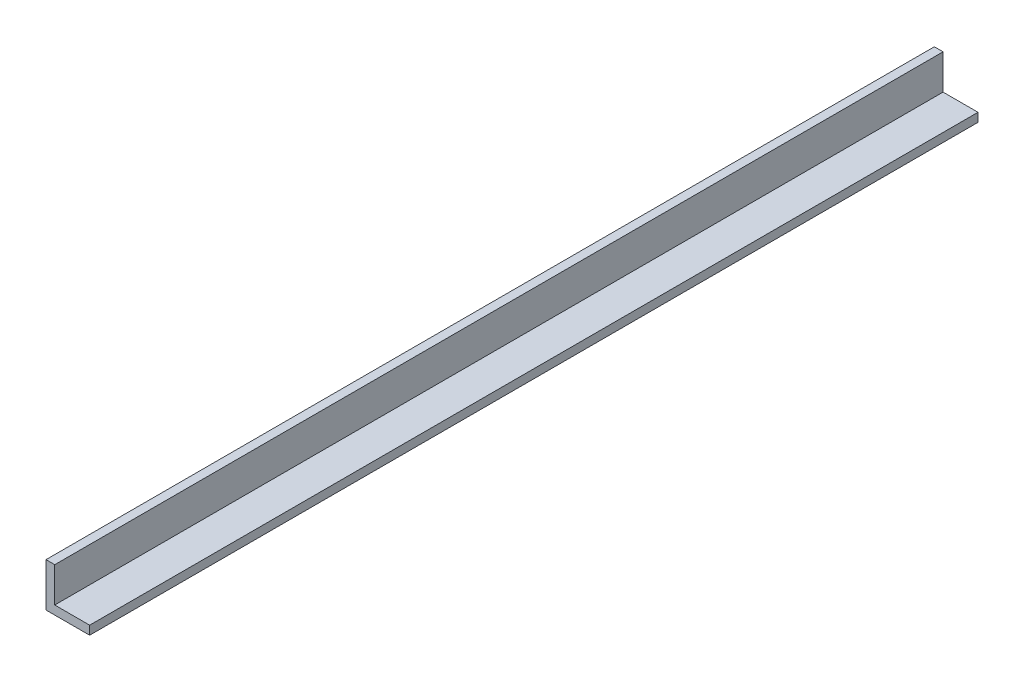
ISO-10303-21;
HEADER;
FILE_DESCRIPTION(('STEP AP214'),'2;1');
FILE_NAME('part.step','',(''),(''),'','','');
FILE_SCHEMA(('AUTOMOTIVE_DESIGN { 1 0 10303 214 1 1 1 1 }'));
ENDSEC;
DATA;
#1=APPLICATION_CONTEXT('core data for automotive mechanical design processes');
#2=APPLICATION_PROTOCOL_DEFINITION('international standard','automotive_design',2000,#1);
#3=PRODUCT_CONTEXT('',#1,'mechanical');
#4=PRODUCT('Part','Part','',(#3));
#5=PRODUCT_RELATED_PRODUCT_CATEGORY('part','',(#4));
#6=PRODUCT_DEFINITION_FORMATION('','',#4);
#7=PRODUCT_DEFINITION_CONTEXT('part definition',#1,'design');
#8=PRODUCT_DEFINITION('design','',#6,#7);
#9=PRODUCT_DEFINITION_SHAPE('','',#8);
#10=(LENGTH_UNIT() NAMED_UNIT(*) SI_UNIT(.MILLI.,.METRE.));
#11=(NAMED_UNIT(*) PLANE_ANGLE_UNIT() SI_UNIT($,.RADIAN.));
#12=(NAMED_UNIT(*) SI_UNIT($,.STERADIAN.) SOLID_ANGLE_UNIT());
#13=UNCERTAINTY_MEASURE_WITH_UNIT(LENGTH_MEASURE(1.E-05),#10,'distance_accuracy_value','');
#14=(GEOMETRIC_REPRESENTATION_CONTEXT(3) GLOBAL_UNCERTAINTY_ASSIGNED_CONTEXT((#13)) GLOBAL_UNIT_ASSIGNED_CONTEXT((#10,
#11,#12)) REPRESENTATION_CONTEXT('',''));
#15=CARTESIAN_POINT('',(0.,0.,0.));
#16=DIRECTION('',(0.,0.,1.));
#17=DIRECTION('',(1.,0.,0.));
#18=AXIS2_PLACEMENT_3D('',#15,#16,#17);
#19=CARTESIAN_POINT('',(-5.99999999999999,20.,407.));
#20=DIRECTION('',(0.,-1.,0.));
#21=DIRECTION('',(1.,0.,0.));
#22=AXIS2_PLACEMENT_3D('',#19,#20,#21);
#23=PLANE('',#22);
#24=DIRECTION('',(-1.,0.,0.));
#25=VECTOR('',#24,1.);
#26=CARTESIAN_POINT('',(-5.99999999999999,20.,0.));
#27=LINE('',#26,#25);
#28=CARTESIAN_POINT('',(-5.99999999999999,20.,0.));
#29=VERTEX_POINT('',#28);
#30=CARTESIAN_POINT('',(-10.,20.,0.));
#31=VERTEX_POINT('',#30);
#32=EDGE_CURVE('E116',#29,#31,#27,.T.);
#33=ORIENTED_EDGE('',*,*,#32,.T.);
#34=DIRECTION('',(0.,0.,-1.));
#35=VECTOR('',#34,1.);
#36=CARTESIAN_POINT('',(-10.,20.,407.));
#37=LINE('',#36,#35);
#38=CARTESIAN_POINT('',(-10.,20.,407.));
#39=VERTEX_POINT('',#38);
#40=EDGE_CURVE('E11',#39,#31,#37,.T.);
#41=ORIENTED_EDGE('',*,*,#40,.F.);
#42=DIRECTION('',(-1.,0.,0.));
#43=VECTOR('',#42,1.);
#44=CARTESIAN_POINT('',(-5.99999999999999,20.,407.));
#45=LINE('',#44,#43);
#46=CARTESIAN_POINT('',(-5.99999999999999,20.,407.));
#47=VERTEX_POINT('',#46);
#48=EDGE_CURVE('E126',#47,#39,#45,.T.);
#49=ORIENTED_EDGE('',*,*,#48,.F.);
#50=DIRECTION('',(0.,0.,-1.));
#51=VECTOR('',#50,1.);
#52=CARTESIAN_POINT('',(-5.99999999999999,20.,407.));
#53=LINE('',#52,#51);
#54=EDGE_CURVE('E112',#47,#29,#53,.T.);
#55=ORIENTED_EDGE('',*,*,#54,.T.);
#56=EDGE_LOOP('',(#33,#41,#49,#55));
#57=FACE_BOUND('',#56,.T.);
#58=ADVANCED_FACE('F32',(#57),#23,.F.);
#59=CARTESIAN_POINT('',(-10.,20.,407.));
#60=DIRECTION('',(1.,0.,0.));
#61=DIRECTION('',(0.,1.,0.));
#62=AXIS2_PLACEMENT_3D('',#59,#60,#61);
#63=PLANE('',#62);
#64=DIRECTION('',(0.,-1.,0.));
#65=VECTOR('',#64,1.);
#66=CARTESIAN_POINT('',(-10.,20.,0.));
#67=LINE('',#66,#65);
#68=CARTESIAN_POINT('',(-10.,0.,0.));
#69=VERTEX_POINT('',#68);
#70=EDGE_CURVE('E119',#31,#69,#67,.T.);
#71=ORIENTED_EDGE('',*,*,#70,.T.);
#72=DIRECTION('',(0.,0.,-1.));
#73=VECTOR('',#72,1.);
#74=CARTESIAN_POINT('',(-10.,0.,407.));
#75=LINE('',#74,#73);
#76=CARTESIAN_POINT('',(-10.,0.,407.));
#77=VERTEX_POINT('',#76);
#78=EDGE_CURVE('E40',#77,#69,#75,.T.);
#79=ORIENTED_EDGE('',*,*,#78,.F.);
#80=DIRECTION('',(0.,-1.,0.));
#81=VECTOR('',#80,1.);
#82=CARTESIAN_POINT('',(-10.,20.,407.));
#83=LINE('',#82,#81);
#84=EDGE_CURVE('E85',#39,#77,#83,.T.);
#85=ORIENTED_EDGE('',*,*,#84,.F.);
#86=ORIENTED_EDGE('',*,*,#40,.T.);
#87=EDGE_LOOP('',(#71,#79,#85,#86));
#88=FACE_BOUND('',#87,.T.);
#89=ADVANCED_FACE('F150',(#88),#63,.F.);
#90=CARTESIAN_POINT('',(-10.,0.,407.));
#91=DIRECTION('',(0.,1.,0.));
#92=DIRECTION('',(-1.,0.,0.));
#93=AXIS2_PLACEMENT_3D('',#90,#91,#92);
#94=PLANE('',#93);
#95=DIRECTION('',(1.,0.,0.));
#96=VECTOR('',#95,1.);
#97=CARTESIAN_POINT('',(-10.,0.,0.));
#98=LINE('',#97,#96);
#99=CARTESIAN_POINT('',(10.,0.,0.));
#100=VERTEX_POINT('',#99);
#101=EDGE_CURVE('E121',#69,#100,#98,.T.);
#102=ORIENTED_EDGE('',*,*,#101,.T.);
#103=DIRECTION('',(0.,0.,-1.));
#104=VECTOR('',#103,1.);
#105=CARTESIAN_POINT('',(10.,0.,407.));
#106=LINE('',#105,#104);
#107=CARTESIAN_POINT('',(10.,0.,407.));
#108=VERTEX_POINT('',#107);
#109=EDGE_CURVE('E107',#108,#100,#106,.T.);
#110=ORIENTED_EDGE('',*,*,#109,.F.);
#111=DIRECTION('',(1.,0.,0.));
#112=VECTOR('',#111,1.);
#113=CARTESIAN_POINT('',(-10.,0.,407.));
#114=LINE('',#113,#112);
#115=EDGE_CURVE('E98',#77,#108,#114,.T.);
#116=ORIENTED_EDGE('',*,*,#115,.F.);
#117=ORIENTED_EDGE('',*,*,#78,.T.);
#118=EDGE_LOOP('',(#102,#110,#116,#117));
#119=FACE_BOUND('',#118,.T.);
#120=ADVANCED_FACE('F132',(#119),#94,.F.);
#121=CARTESIAN_POINT('',(10.,0.,407.));
#122=DIRECTION('',(-1.,0.,0.));
#123=DIRECTION('',(0.,0.,1.));
#124=AXIS2_PLACEMENT_3D('',#121,#122,#123);
#125=PLANE('',#124);
#126=DIRECTION('',(0.,1.,0.));
#127=VECTOR('',#126,1.);
#128=CARTESIAN_POINT('',(10.,0.,0.));
#129=LINE('',#128,#127);
#130=CARTESIAN_POINT('',(10.,4.,0.));
#131=VERTEX_POINT('',#130);
#132=EDGE_CURVE('E106',#100,#131,#129,.T.);
#133=ORIENTED_EDGE('',*,*,#132,.T.);
#134=DIRECTION('',(0.,0.,-1.));
#135=VECTOR('',#134,1.);
#136=CARTESIAN_POINT('',(10.,4.,407.));
#137=LINE('',#136,#135);
#138=CARTESIAN_POINT('',(10.,4.,407.));
#139=VERTEX_POINT('',#138);
#140=EDGE_CURVE('E103',#139,#131,#137,.T.);
#141=ORIENTED_EDGE('',*,*,#140,.F.);
#142=DIRECTION('',(0.,1.,0.));
#143=VECTOR('',#142,1.);
#144=CARTESIAN_POINT('',(10.,0.,407.));
#145=LINE('',#144,#143);
#146=EDGE_CURVE('E92',#108,#139,#145,.T.);
#147=ORIENTED_EDGE('',*,*,#146,.F.);
#148=ORIENTED_EDGE('',*,*,#109,.T.);
#149=EDGE_LOOP('',(#133,#141,#147,#148));
#150=FACE_BOUND('',#149,.T.);
#151=ADVANCED_FACE('F104',(#150),#125,.F.);
#152=CARTESIAN_POINT('',(10.,4.,407.));
#153=DIRECTION('',(0.,-1.,0.));
#154=DIRECTION('',(0.,0.,-1.));
#155=AXIS2_PLACEMENT_3D('',#152,#153,#154);
#156=PLANE('',#155);
#157=DIRECTION('',(-1.,0.,0.));
#158=VECTOR('',#157,1.);
#159=CARTESIAN_POINT('',(10.,4.,0.));
#160=LINE('',#159,#158);
#161=CARTESIAN_POINT('',(-5.99999999999999,4.,0.));
#162=VERTEX_POINT('',#161);
#163=EDGE_CURVE('E71',#131,#162,#160,.T.);
#164=ORIENTED_EDGE('',*,*,#163,.T.);
#165=DIRECTION('',(0.,0.,-1.));
#166=VECTOR('',#165,1.);
#167=CARTESIAN_POINT('',(-5.99999999999999,4.,407.));
#168=LINE('',#167,#166);
#169=CARTESIAN_POINT('',(-5.99999999999999,4.,407.));
#170=VERTEX_POINT('',#169);
#171=EDGE_CURVE('E108',#170,#162,#168,.T.);
#172=ORIENTED_EDGE('',*,*,#171,.F.);
#173=DIRECTION('',(-1.,0.,0.));
#174=VECTOR('',#173,1.);
#175=CARTESIAN_POINT('',(10.,4.,407.));
#176=LINE('',#175,#174);
#177=EDGE_CURVE('E96',#139,#170,#176,.T.);
#178=ORIENTED_EDGE('',*,*,#177,.F.);
#179=ORIENTED_EDGE('',*,*,#140,.T.);
#180=EDGE_LOOP('',(#164,#172,#178,#179));
#181=FACE_BOUND('',#180,.T.);
#182=ADVANCED_FACE('F110',(#181),#156,.F.);
#183=CARTESIAN_POINT('',(-5.99999999999999,4.,407.));
#184=DIRECTION('',(-1.,0.,0.));
#185=DIRECTION('',(0.,0.,1.));
#186=AXIS2_PLACEMENT_3D('',#183,#184,#185);
#187=PLANE('',#186);
#188=DIRECTION('',(0.,1.,0.));
#189=VECTOR('',#188,1.);
#190=CARTESIAN_POINT('',(-5.99999999999999,4.,0.));
#191=LINE('',#190,#189);
#192=EDGE_CURVE('E77',#162,#29,#191,.T.);
#193=ORIENTED_EDGE('',*,*,#192,.T.);
#194=ORIENTED_EDGE('',*,*,#54,.F.);
#195=DIRECTION('',(0.,1.,0.));
#196=VECTOR('',#195,1.);
#197=CARTESIAN_POINT('',(-5.99999999999999,4.,407.));
#198=LINE('',#197,#196);
#199=EDGE_CURVE('E48',#170,#47,#198,.T.);
#200=ORIENTED_EDGE('',*,*,#199,.F.);
#201=ORIENTED_EDGE('',*,*,#171,.T.);
#202=EDGE_LOOP('',(#193,#194,#200,#201));
#203=FACE_BOUND('',#202,.T.);
#204=ADVANCED_FACE('F139',(#203),#187,.F.);
#205=CARTESIAN_POINT('',(0.,0.,407.));
#206=DIRECTION('',(0.,0.,1.));
#207=DIRECTION('',(1.,0.,0.));
#208=AXIS2_PLACEMENT_3D('',#205,#206,#207);
#209=PLANE('',#208);
#210=ORIENTED_EDGE('',*,*,#48,.T.);
#211=ORIENTED_EDGE('',*,*,#84,.T.);
#212=ORIENTED_EDGE('',*,*,#115,.T.);
#213=ORIENTED_EDGE('',*,*,#146,.T.);
#214=ORIENTED_EDGE('',*,*,#177,.T.);
#215=ORIENTED_EDGE('',*,*,#199,.T.);
#216=EDGE_LOOP('',(#210,#211,#212,#213,#214,#215));
#217=FACE_BOUND('',#216,.T.);
#218=ADVANCED_FACE('F94',(#217),#209,.T.);
#219=CARTESIAN_POINT('',(0.,0.,0.));
#220=DIRECTION('',(0.,0.,1.));
#221=DIRECTION('',(1.,0.,0.));
#222=AXIS2_PLACEMENT_3D('',#219,#220,#221);
#223=PLANE('',#222);
#224=ORIENTED_EDGE('',*,*,#32,.F.);
#225=ORIENTED_EDGE('',*,*,#192,.F.);
#226=ORIENTED_EDGE('',*,*,#163,.F.);
#227=ORIENTED_EDGE('',*,*,#132,.F.);
#228=ORIENTED_EDGE('',*,*,#101,.F.);
#229=ORIENTED_EDGE('',*,*,#70,.F.);
#230=EDGE_LOOP('',(#224,#225,#226,#227,#228,#229));
#231=FACE_BOUND('',#230,.T.);
#232=ADVANCED_FACE('F135',(#231),#223,.F.);
#233=CLOSED_SHELL('',(#58,#89,#120,#151,#182,#204,#218,#232));
#234=MANIFOLD_SOLID_BREP('B2',#233);
#235=ADVANCED_BREP_SHAPE_REPRESENTATION('',(#18,#234),#14);
#236=SHAPE_DEFINITION_REPRESENTATION(#9,#235);
ENDSEC;
END-ISO-10303-21;
